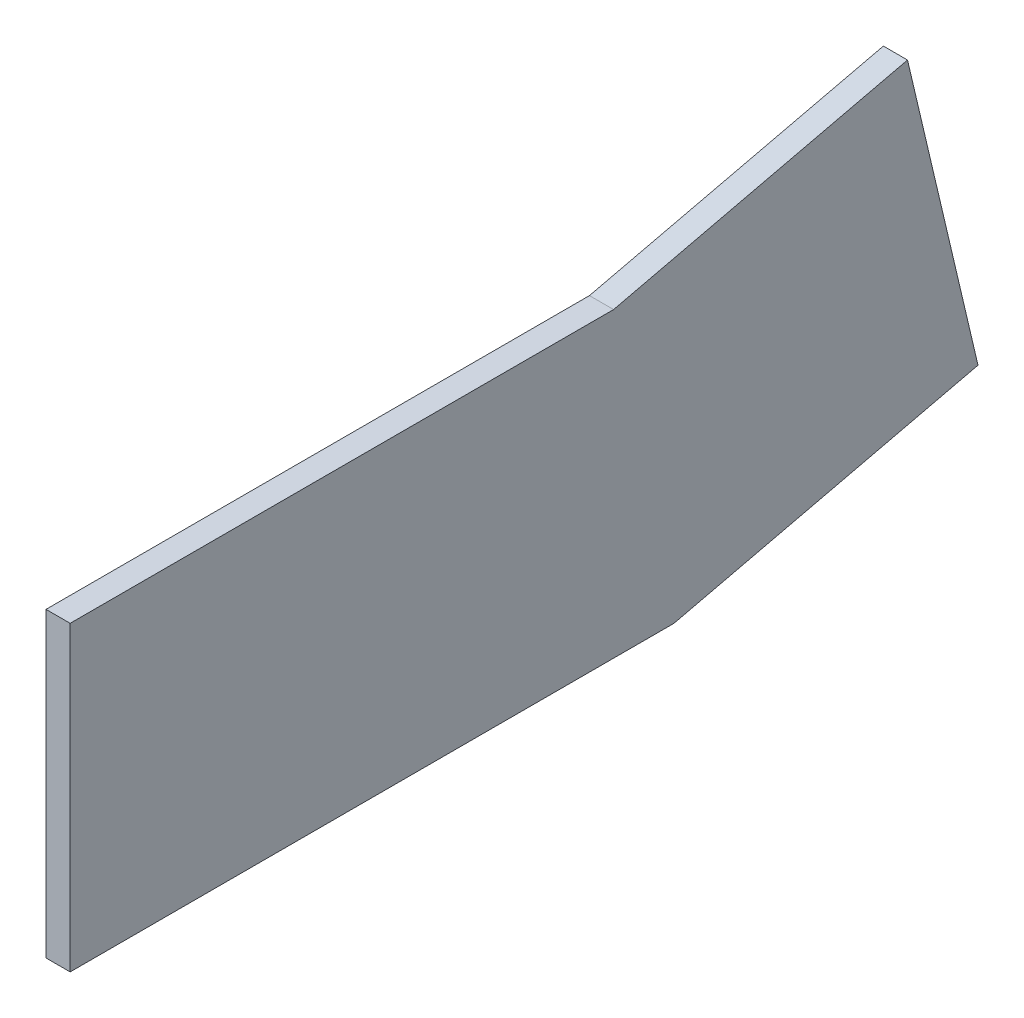
ISO-10303-21;
HEADER;
FILE_DESCRIPTION(('STEP AP214'),'2;1');
FILE_NAME('part.step','',(''),(''),'','','');
FILE_SCHEMA(('AUTOMOTIVE_DESIGN { 1 0 10303 214 1 1 1 1 }'));
ENDSEC;
DATA;
#1=APPLICATION_CONTEXT('core data for automotive mechanical design processes');
#2=APPLICATION_PROTOCOL_DEFINITION('international standard','automotive_design',2000,#1);
#3=PRODUCT_CONTEXT('',#1,'mechanical');
#4=PRODUCT('Part','Part','',(#3));
#5=PRODUCT_RELATED_PRODUCT_CATEGORY('part','',(#4));
#6=PRODUCT_DEFINITION_FORMATION('','',#4);
#7=PRODUCT_DEFINITION_CONTEXT('part definition',#1,'design');
#8=PRODUCT_DEFINITION('design','',#6,#7);
#9=PRODUCT_DEFINITION_SHAPE('','',#8);
#10=(LENGTH_UNIT() NAMED_UNIT(*) SI_UNIT(.MILLI.,.METRE.));
#11=(NAMED_UNIT(*) PLANE_ANGLE_UNIT() SI_UNIT($,.RADIAN.));
#12=(NAMED_UNIT(*) SI_UNIT($,.STERADIAN.) SOLID_ANGLE_UNIT());
#13=UNCERTAINTY_MEASURE_WITH_UNIT(LENGTH_MEASURE(1.E-05),#10,'distance_accuracy_value','');
#14=(GEOMETRIC_REPRESENTATION_CONTEXT(3) GLOBAL_UNCERTAINTY_ASSIGNED_CONTEXT((#13)) GLOBAL_UNIT_ASSIGNED_CONTEXT((#10,
#11,#12)) REPRESENTATION_CONTEXT('',''));
#15=CARTESIAN_POINT('',(0.,0.,0.));
#16=DIRECTION('',(0.,0.,1.));
#17=DIRECTION('',(1.,0.,0.));
#18=AXIS2_PLACEMENT_3D('',#15,#16,#17);
#19=CARTESIAN_POINT('',(2.,24.8032786885246,5.83606557377049));
#20=DIRECTION('',(0.,-0.229039333725547,0.973417168333576));
#21=DIRECTION('',(0.,-0.973417168333576,-0.229039333725547));
#22=AXIS2_PLACEMENT_3D('',#19,#20,#21);
#23=PLANE('',#22);
#24=DIRECTION('',(0.,0.973417168333576,0.229039333725547));
#25=VECTOR('',#24,1.);
#26=CARTESIAN_POINT('',(0.,24.8032786885246,5.83606557377049));
#27=LINE('',#26,#25);
#28=CARTESIAN_POINT('',(0.,0.,0.));
#29=VERTEX_POINT('',#28);
#30=CARTESIAN_POINT('',(0.,24.8032786885246,5.83606557377049));
#31=VERTEX_POINT('',#30);
#32=EDGE_CURVE('E117',#29,#31,#27,.T.);
#33=ORIENTED_EDGE('',*,*,#32,.T.);
#34=DIRECTION('',(-1.,0.,0.));
#35=VECTOR('',#34,1.);
#36=CARTESIAN_POINT('',(2.,24.8032786885246,5.83606557377049));
#37=LINE('',#36,#35);
#38=CARTESIAN_POINT('',(2.,24.8032786885246,5.83606557377049));
#39=VERTEX_POINT('',#38);
#40=EDGE_CURVE('E11',#39,#31,#37,.T.);
#41=ORIENTED_EDGE('',*,*,#40,.F.);
#42=DIRECTION('',(0.,0.973417168333576,0.229039333725547));
#43=VECTOR('',#42,1.);
#44=CARTESIAN_POINT('',(2.,24.8032786885246,5.83606557377049));
#45=LINE('',#44,#43);
#46=CARTESIAN_POINT('',(2.,0.,0.));
#47=VERTEX_POINT('',#46);
#48=EDGE_CURVE('E127',#47,#39,#45,.T.);
#49=ORIENTED_EDGE('',*,*,#48,.F.);
#50=DIRECTION('',(-1.,0.,0.));
#51=VECTOR('',#50,1.);
#52=CARTESIAN_POINT('',(2.,0.,0.));
#53=LINE('',#52,#51);
#54=EDGE_CURVE('E113',#47,#29,#53,.T.);
#55=ORIENTED_EDGE('',*,*,#54,.T.);
#56=EDGE_LOOP('',(#33,#41,#49,#55));
#57=FACE_BOUND('',#56,.T.);
#58=ADVANCED_FACE('F33',(#57),#23,.F.);
#59=CARTESIAN_POINT('',(2.,19.0772953453859,30.1714947821099));
#60=DIRECTION('',(0.,-0.973417168333576,-0.229039333725548));
#61=DIRECTION('',(0.,0.229039333725548,-0.973417168333576));
#62=AXIS2_PLACEMENT_3D('',#59,#60,#61);
#63=PLANE('',#62);
#64=DIRECTION('',(0.,-0.229039333725548,0.973417168333576));
#65=VECTOR('',#64,1.);
#66=CARTESIAN_POINT('',(0.,19.0772953453859,30.1714947821099));
#67=LINE('',#66,#65);
#68=CARTESIAN_POINT('',(0.,19.0772953453859,30.1714947821099));
#69=VERTEX_POINT('',#68);
#70=EDGE_CURVE('E120',#31,#69,#67,.T.);
#71=ORIENTED_EDGE('',*,*,#70,.T.);
#72=DIRECTION('',(-1.,0.,0.));
#73=VECTOR('',#72,1.);
#74=CARTESIAN_POINT('',(2.,19.0772953453859,30.1714947821099));
#75=LINE('',#74,#73);
#76=CARTESIAN_POINT('',(2.,19.0772953453859,30.1714947821099));
#77=VERTEX_POINT('',#76);
#78=EDGE_CURVE('E41',#77,#69,#75,.T.);
#79=ORIENTED_EDGE('',*,*,#78,.F.);
#80=DIRECTION('',(0.,-0.229039333725548,0.973417168333576));
#81=VECTOR('',#80,1.);
#82=CARTESIAN_POINT('',(2.,19.0772953453859,30.1714947821099));
#83=LINE('',#82,#81);
#84=EDGE_CURVE('E86',#39,#77,#83,.T.);
#85=ORIENTED_EDGE('',*,*,#84,.F.);
#86=ORIENTED_EDGE('',*,*,#40,.T.);
#87=EDGE_LOOP('',(#71,#79,#85,#86));
#88=FACE_BOUND('',#87,.T.);
#89=ADVANCED_FACE('F151',(#88),#63,.F.);
#90=CARTESIAN_POINT('',(2.,19.0772953453859,75.1714947821099));
#91=DIRECTION('',(0.,-1.,0.));
#92=DIRECTION('',(0.,0.,-1.));
#93=AXIS2_PLACEMENT_3D('',#90,#91,#92);
#94=PLANE('',#93);
#95=DIRECTION('',(0.,0.,1.));
#96=VECTOR('',#95,1.);
#97=CARTESIAN_POINT('',(0.,19.0772953453859,75.1714947821099));
#98=LINE('',#97,#96);
#99=CARTESIAN_POINT('',(0.,19.0772953453859,75.1714947821099));
#100=VERTEX_POINT('',#99);
#101=EDGE_CURVE('E122',#69,#100,#98,.T.);
#102=ORIENTED_EDGE('',*,*,#101,.T.);
#103=DIRECTION('',(-1.,0.,0.));
#104=VECTOR('',#103,1.);
#105=CARTESIAN_POINT('',(2.,19.0772953453859,75.1714947821099));
#106=LINE('',#105,#104);
#107=CARTESIAN_POINT('',(2.,19.0772953453859,75.1714947821099));
#108=VERTEX_POINT('',#107);
#109=EDGE_CURVE('E108',#108,#100,#106,.T.);
#110=ORIENTED_EDGE('',*,*,#109,.F.);
#111=DIRECTION('',(0.,0.,1.));
#112=VECTOR('',#111,1.);
#113=CARTESIAN_POINT('',(2.,19.0772953453859,75.1714947821099));
#114=LINE('',#113,#112);
#115=EDGE_CURVE('E99',#77,#108,#114,.T.);
#116=ORIENTED_EDGE('',*,*,#115,.F.);
#117=ORIENTED_EDGE('',*,*,#78,.T.);
#118=EDGE_LOOP('',(#102,#110,#116,#117));
#119=FACE_BOUND('',#118,.T.);
#120=ADVANCED_FACE('F133',(#119),#94,.F.);
#121=CARTESIAN_POINT('',(2.,-5.92270465461409,75.1714947821099));
#122=DIRECTION('',(0.,0.,-1.));
#123=DIRECTION('',(-1.,0.,0.));
#124=AXIS2_PLACEMENT_3D('',#121,#122,#123);
#125=PLANE('',#124);
#126=DIRECTION('',(0.,-1.,0.));
#127=VECTOR('',#126,1.);
#128=CARTESIAN_POINT('',(0.,-5.92270465461409,75.1714947821099));
#129=LINE('',#128,#127);
#130=CARTESIAN_POINT('',(0.,-5.92270465461409,75.1714947821099));
#131=VERTEX_POINT('',#130);
#132=EDGE_CURVE('E107',#100,#131,#129,.T.);
#133=ORIENTED_EDGE('',*,*,#132,.T.);
#134=DIRECTION('',(-1.,0.,0.));
#135=VECTOR('',#134,1.);
#136=CARTESIAN_POINT('',(2.,-5.92270465461409,75.1714947821099));
#137=LINE('',#136,#135);
#138=CARTESIAN_POINT('',(2.,-5.92270465461409,75.1714947821099));
#139=VERTEX_POINT('',#138);
#140=EDGE_CURVE('E104',#139,#131,#137,.T.);
#141=ORIENTED_EDGE('',*,*,#140,.F.);
#142=DIRECTION('',(0.,-1.,0.));
#143=VECTOR('',#142,1.);
#144=CARTESIAN_POINT('',(2.,-5.92270465461409,75.1714947821099));
#145=LINE('',#144,#143);
#146=EDGE_CURVE('E93',#108,#139,#145,.T.);
#147=ORIENTED_EDGE('',*,*,#146,.F.);
#148=ORIENTED_EDGE('',*,*,#109,.T.);
#149=EDGE_LOOP('',(#133,#141,#147,#148));
#150=FACE_BOUND('',#149,.T.);
#151=ADVANCED_FACE('F105',(#150),#125,.F.);
#152=CARTESIAN_POINT('',(2.,-5.92270465461408,25.1714947821099));
#153=DIRECTION('',(0.,1.,0.));
#154=DIRECTION('',(0.,0.,1.));
#155=AXIS2_PLACEMENT_3D('',#152,#153,#154);
#156=PLANE('',#155);
#157=DIRECTION('',(0.,0.,-1.));
#158=VECTOR('',#157,1.);
#159=CARTESIAN_POINT('',(0.,-5.92270465461408,25.1714947821099));
#160=LINE('',#159,#158);
#161=CARTESIAN_POINT('',(0.,-5.92270465461408,25.1714947821099));
#162=VERTEX_POINT('',#161);
#163=EDGE_CURVE('E72',#131,#162,#160,.T.);
#164=ORIENTED_EDGE('',*,*,#163,.T.);
#165=DIRECTION('',(-1.,0.,0.));
#166=VECTOR('',#165,1.);
#167=CARTESIAN_POINT('',(2.,-5.92270465461408,25.1714947821099));
#168=LINE('',#167,#166);
#169=CARTESIAN_POINT('',(2.,-5.92270465461408,25.1714947821099));
#170=VERTEX_POINT('',#169);
#171=EDGE_CURVE('E109',#170,#162,#168,.T.);
#172=ORIENTED_EDGE('',*,*,#171,.F.);
#173=DIRECTION('',(0.,0.,-1.));
#174=VECTOR('',#173,1.);
#175=CARTESIAN_POINT('',(2.,-5.92270465461408,25.1714947821099));
#176=LINE('',#175,#174);
#177=EDGE_CURVE('E97',#139,#170,#176,.T.);
#178=ORIENTED_EDGE('',*,*,#177,.F.);
#179=ORIENTED_EDGE('',*,*,#140,.T.);
#180=EDGE_LOOP('',(#164,#172,#178,#179));
#181=FACE_BOUND('',#180,.T.);
#182=ADVANCED_FACE('F111',(#181),#156,.F.);
#183=CARTESIAN_POINT('',(2.,0.,0.));
#184=DIRECTION('',(0.,0.973417168333576,0.229039333725547));
#185=DIRECTION('',(0.,-0.229039333725547,0.973417168333576));
#186=AXIS2_PLACEMENT_3D('',#183,#184,#185);
#187=PLANE('',#186);
#188=DIRECTION('',(0.,0.229039333725547,-0.973417168333576));
#189=VECTOR('',#188,1.);
#190=CARTESIAN_POINT('',(0.,0.,0.));
#191=LINE('',#190,#189);
#192=EDGE_CURVE('E78',#162,#29,#191,.T.);
#193=ORIENTED_EDGE('',*,*,#192,.T.);
#194=ORIENTED_EDGE('',*,*,#54,.F.);
#195=DIRECTION('',(0.,0.229039333725547,-0.973417168333576));
#196=VECTOR('',#195,1.);
#197=CARTESIAN_POINT('',(2.,0.,0.));
#198=LINE('',#197,#196);
#199=EDGE_CURVE('E49',#170,#47,#198,.T.);
#200=ORIENTED_EDGE('',*,*,#199,.F.);
#201=ORIENTED_EDGE('',*,*,#171,.T.);
#202=EDGE_LOOP('',(#193,#194,#200,#201));
#203=FACE_BOUND('',#202,.T.);
#204=ADVANCED_FACE('F140',(#203),#187,.F.);
#205=CARTESIAN_POINT('',(2.,0.,0.));
#206=DIRECTION('',(-1.,0.,0.));
#207=DIRECTION('',(0.,0.,1.));
#208=AXIS2_PLACEMENT_3D('',#205,#206,#207);
#209=PLANE('',#208);
#210=ORIENTED_EDGE('',*,*,#48,.T.);
#211=ORIENTED_EDGE('',*,*,#84,.T.);
#212=ORIENTED_EDGE('',*,*,#115,.T.);
#213=ORIENTED_EDGE('',*,*,#146,.T.);
#214=ORIENTED_EDGE('',*,*,#177,.T.);
#215=ORIENTED_EDGE('',*,*,#199,.T.);
#216=EDGE_LOOP('',(#210,#211,#212,#213,#214,#215));
#217=FACE_BOUND('',#216,.T.);
#218=ADVANCED_FACE('F95',(#217),#209,.F.);
#219=CARTESIAN_POINT('',(0.,0.,0.));
#220=DIRECTION('',(-1.,0.,0.));
#221=DIRECTION('',(0.,0.,1.));
#222=AXIS2_PLACEMENT_3D('',#219,#220,#221);
#223=PLANE('',#222);
#224=ORIENTED_EDGE('',*,*,#32,.F.);
#225=ORIENTED_EDGE('',*,*,#192,.F.);
#226=ORIENTED_EDGE('',*,*,#163,.F.);
#227=ORIENTED_EDGE('',*,*,#132,.F.);
#228=ORIENTED_EDGE('',*,*,#101,.F.);
#229=ORIENTED_EDGE('',*,*,#70,.F.);
#230=EDGE_LOOP('',(#224,#225,#226,#227,#228,#229));
#231=FACE_BOUND('',#230,.T.);
#232=ADVANCED_FACE('F136',(#231),#223,.T.);
#233=CLOSED_SHELL('',(#58,#89,#120,#151,#182,#204,#218,#232));
#234=MANIFOLD_SOLID_BREP('B2',#233);
#235=ADVANCED_BREP_SHAPE_REPRESENTATION('',(#18,#234),#14);
#236=SHAPE_DEFINITION_REPRESENTATION(#9,#235);
ENDSEC;
END-ISO-10303-21;
